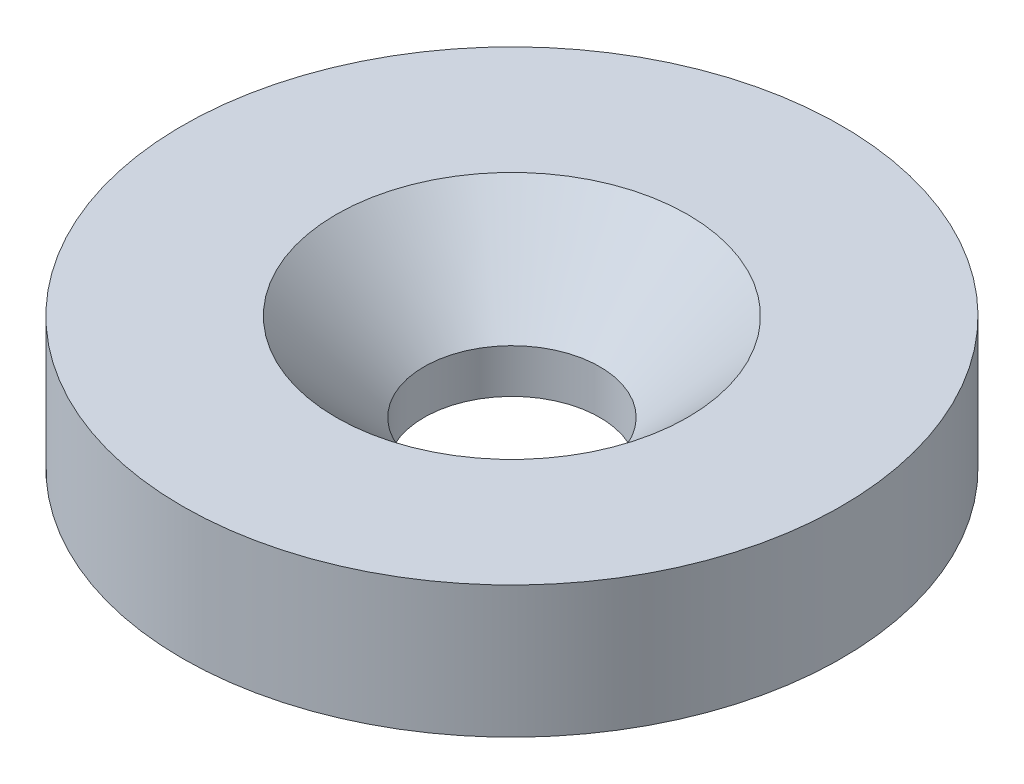
ISO-10303-21;
HEADER;
FILE_DESCRIPTION(('STEP AP214'),'2;1');
FILE_NAME('part.step','',(''),(''),'','','');
FILE_SCHEMA(('AUTOMOTIVE_DESIGN { 1 0 10303 214 1 1 1 1 }'));
ENDSEC;
DATA;
#1=APPLICATION_CONTEXT('core data for automotive mechanical design processes');
#2=APPLICATION_PROTOCOL_DEFINITION('international standard','automotive_design',2000,#1);
#3=PRODUCT_CONTEXT('',#1,'mechanical');
#4=PRODUCT('Part','Part','',(#3));
#5=PRODUCT_RELATED_PRODUCT_CATEGORY('part','',(#4));
#6=PRODUCT_DEFINITION_FORMATION('','',#4);
#7=PRODUCT_DEFINITION_CONTEXT('part definition',#1,'design');
#8=PRODUCT_DEFINITION('design','',#6,#7);
#9=PRODUCT_DEFINITION_SHAPE('','',#8);
#10=(LENGTH_UNIT() NAMED_UNIT(*) SI_UNIT(.MILLI.,.METRE.));
#11=(NAMED_UNIT(*) PLANE_ANGLE_UNIT() SI_UNIT($,.RADIAN.));
#12=(NAMED_UNIT(*) SI_UNIT($,.STERADIAN.) SOLID_ANGLE_UNIT());
#13=UNCERTAINTY_MEASURE_WITH_UNIT(LENGTH_MEASURE(1.E-05),#10,'distance_accuracy_value','');
#14=(GEOMETRIC_REPRESENTATION_CONTEXT(3) GLOBAL_UNCERTAINTY_ASSIGNED_CONTEXT((#13)) GLOBAL_UNIT_ASSIGNED_CONTEXT((#10,
#11,#12)) REPRESENTATION_CONTEXT('',''));
#15=CARTESIAN_POINT('',(0.,0.,0.));
#16=DIRECTION('',(0.,0.,1.));
#17=DIRECTION('',(1.,0.,0.));
#18=AXIS2_PLACEMENT_3D('',#15,#16,#17);
#19=CARTESIAN_POINT('',(0.,3.,0.));
#20=DIRECTION('',(0.,-1.,0.));
#21=DIRECTION('',(0.,0.,-1.));
#22=AXIS2_PLACEMENT_3D('',#19,#20,#21);
#23=CYLINDRICAL_SURFACE('',#22,7.5);
#24=CARTESIAN_POINT('',(0.,3.,0.));
#25=DIRECTION('',(0.,1.,0.));
#26=DIRECTION('',(0.,0.,1.));
#27=AXIS2_PLACEMENT_3D('',#24,#25,#26);
#28=CIRCLE('',#27,7.5);
#29=CARTESIAN_POINT('',(0.,3.,7.5));
#30=VERTEX_POINT('',#29);
#31=EDGE_CURVE('E10',#30,#30,#28,.T.);
#32=ORIENTED_EDGE('',*,*,#31,.F.);
#33=EDGE_LOOP('',(#32));
#34=FACE_BOUND('',#33,.T.);
#35=CARTESIAN_POINT('',(0.,0.,0.));
#36=DIRECTION('',(0.,1.,0.));
#37=DIRECTION('',(0.,0.,1.));
#38=AXIS2_PLACEMENT_3D('',#35,#36,#37);
#39=CIRCLE('',#38,7.5);
#40=CARTESIAN_POINT('',(0.,0.,7.5));
#41=VERTEX_POINT('',#40);
#42=EDGE_CURVE('E46',#41,#41,#39,.T.);
#43=ORIENTED_EDGE('',*,*,#42,.T.);
#44=EDGE_LOOP('',(#43));
#45=FACE_BOUND('',#44,.T.);
#46=ADVANCED_FACE('F39',(#34,#45),#23,.T.);
#47=CARTESIAN_POINT('',(0.,3.,0.));
#48=DIRECTION('',(0.,1.,0.));
#49=DIRECTION('',(0.,0.,1.));
#50=AXIS2_PLACEMENT_3D('',#47,#48,#49);
#51=PLANE('',#50);
#52=CARTESIAN_POINT('',(0.,3.,0.));
#53=DIRECTION('',(0.,1.,0.));
#54=DIRECTION('',(0.,0.,1.));
#55=AXIS2_PLACEMENT_3D('',#52,#53,#54);
#56=CIRCLE('',#55,4.);
#57=CARTESIAN_POINT('',(0.,3.,4.));
#58=VERTEX_POINT('',#57);
#59=EDGE_CURVE('E55',#58,#58,#56,.T.);
#60=ORIENTED_EDGE('',*,*,#59,.F.);
#61=EDGE_LOOP('',(#60));
#62=FACE_BOUND('',#61,.T.);
#63=ORIENTED_EDGE('',*,*,#31,.T.);
#64=EDGE_LOOP('',(#63));
#65=FACE_BOUND('',#64,.T.);
#66=ADVANCED_FACE('F61',(#62,#65),#51,.T.);
#67=CARTESIAN_POINT('',(0.,0.,0.));
#68=DIRECTION('',(0.,1.,0.));
#69=DIRECTION('',(0.,0.,1.));
#70=AXIS2_PLACEMENT_3D('',#67,#68,#69);
#71=PLANE('',#70);
#72=CARTESIAN_POINT('',(0.,0.,0.));
#73=DIRECTION('',(0.,1.,0.));
#74=DIRECTION('',(0.,0.,1.));
#75=AXIS2_PLACEMENT_3D('',#72,#73,#74);
#76=CIRCLE('',#75,2.);
#77=CARTESIAN_POINT('',(0.,0.,2.));
#78=VERTEX_POINT('',#77);
#79=EDGE_CURVE('E42',#78,#78,#76,.T.);
#80=ORIENTED_EDGE('',*,*,#79,.T.);
#81=EDGE_LOOP('',(#80));
#82=FACE_BOUND('',#81,.T.);
#83=ORIENTED_EDGE('',*,*,#42,.F.);
#84=EDGE_LOOP('',(#83));
#85=FACE_BOUND('',#84,.T.);
#86=ADVANCED_FACE('F63',(#82,#85),#71,.F.);
#87=CARTESIAN_POINT('',(0.,3.,0.));
#88=DIRECTION('',(0.,1.,0.));
#89=DIRECTION('',(0.,0.,1.));
#90=AXIS2_PLACEMENT_3D('',#87,#88,#89);
#91=CYLINDRICAL_SURFACE('',#90,2.);
#92=CARTESIAN_POINT('',(0.,0.999999999999999,0.));
#93=DIRECTION('',(0.,1.,0.));
#94=DIRECTION('',(0.,0.,1.));
#95=AXIS2_PLACEMENT_3D('',#92,#93,#94);
#96=CIRCLE('',#95,2.);
#97=CARTESIAN_POINT('',(0.,0.999999999999999,2.));
#98=VERTEX_POINT('',#97);
#99=EDGE_CURVE('E52',#98,#98,#96,.T.);
#100=ORIENTED_EDGE('',*,*,#99,.T.);
#101=EDGE_LOOP('',(#100));
#102=FACE_BOUND('',#101,.T.);
#103=ORIENTED_EDGE('',*,*,#79,.F.);
#104=EDGE_LOOP('',(#103));
#105=FACE_BOUND('',#104,.T.);
#106=ADVANCED_FACE('F69',(#102,#105),#91,.F.);
#107=CARTESIAN_POINT('',(0.,3.,0.));
#108=DIRECTION('',(0.,1.,0.));
#109=DIRECTION('',(0.,0.,1.));
#110=AXIS2_PLACEMENT_3D('',#107,#108,#109);
#111=CONICAL_SURFACE('',#110,4.,0.785398163397448);
#112=ORIENTED_EDGE('',*,*,#99,.F.);
#113=EDGE_LOOP('',(#112));
#114=FACE_BOUND('',#113,.T.);
#115=ORIENTED_EDGE('',*,*,#59,.T.);
#116=EDGE_LOOP('',(#115));
#117=FACE_BOUND('',#116,.T.);
#118=ADVANCED_FACE('F59',(#114,#117),#111,.F.);
#119=CLOSED_SHELL('',(#46,#66,#86,#106,#118));
#120=MANIFOLD_SOLID_BREP('B2',#119);
#121=ADVANCED_BREP_SHAPE_REPRESENTATION('',(#18,#120),#14);
#122=SHAPE_DEFINITION_REPRESENTATION(#9,#121);
ENDSEC;
END-ISO-10303-21;
